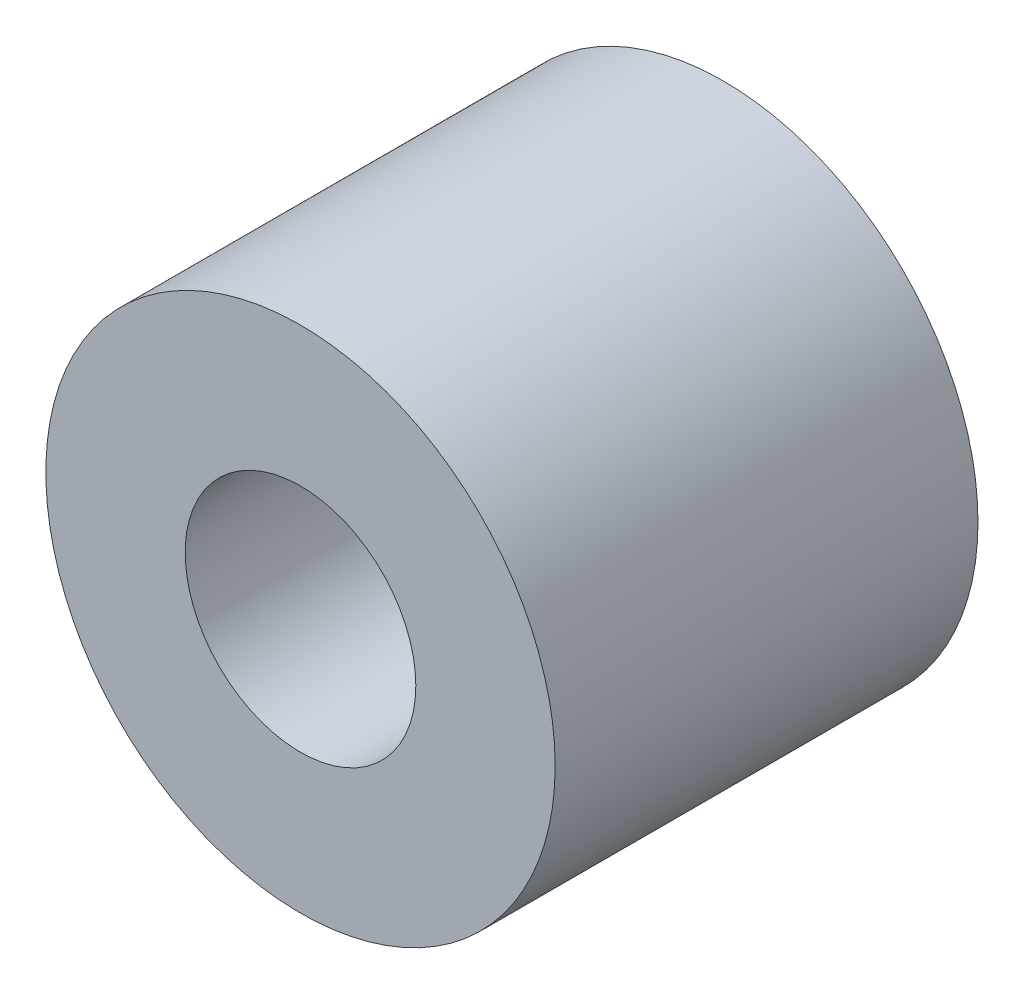
ISO-10303-21;
HEADER;
FILE_DESCRIPTION(('STEP AP214'),'2;1');
FILE_NAME('part.step','',(''),(''),'','','');
FILE_SCHEMA(('AUTOMOTIVE_DESIGN { 1 0 10303 214 1 1 1 1 }'));
ENDSEC;
DATA;
#1=APPLICATION_CONTEXT('core data for automotive mechanical design processes');
#2=APPLICATION_PROTOCOL_DEFINITION('international standard','automotive_design',2000,#1);
#3=PRODUCT_CONTEXT('',#1,'mechanical');
#4=PRODUCT('Part','Part','',(#3));
#5=PRODUCT_RELATED_PRODUCT_CATEGORY('part','',(#4));
#6=PRODUCT_DEFINITION_FORMATION('','',#4);
#7=PRODUCT_DEFINITION_CONTEXT('part definition',#1,'design');
#8=PRODUCT_DEFINITION('design','',#6,#7);
#9=PRODUCT_DEFINITION_SHAPE('','',#8);
#10=(LENGTH_UNIT() NAMED_UNIT(*) SI_UNIT(.MILLI.,.METRE.));
#11=(NAMED_UNIT(*) PLANE_ANGLE_UNIT() SI_UNIT($,.RADIAN.));
#12=(NAMED_UNIT(*) SI_UNIT($,.STERADIAN.) SOLID_ANGLE_UNIT());
#13=UNCERTAINTY_MEASURE_WITH_UNIT(LENGTH_MEASURE(1.E-05),#10,'distance_accuracy_value','');
#14=(GEOMETRIC_REPRESENTATION_CONTEXT(3) GLOBAL_UNCERTAINTY_ASSIGNED_CONTEXT((#13)) GLOBAL_UNIT_ASSIGNED_CONTEXT((#10,
#11,#12)) REPRESENTATION_CONTEXT('',''));
#15=CARTESIAN_POINT('',(0.,0.,0.));
#16=DIRECTION('',(0.,0.,1.));
#17=DIRECTION('',(1.,0.,0.));
#18=AXIS2_PLACEMENT_3D('',#15,#16,#17);
#19=CARTESIAN_POINT('',(0.,0.,44.));
#20=DIRECTION('',(0.,0.,-1.));
#21=DIRECTION('',(-1.,0.,0.));
#22=AXIS2_PLACEMENT_3D('',#19,#20,#21);
#23=CYLINDRICAL_SURFACE('',#22,26.5);
#24=CARTESIAN_POINT('',(0.,0.,44.));
#25=DIRECTION('',(0.,0.,1.));
#26=DIRECTION('',(1.,0.,0.));
#27=AXIS2_PLACEMENT_3D('',#24,#25,#26);
#28=CIRCLE('',#27,26.5);
#29=CARTESIAN_POINT('',(26.5,0.,44.));
#30=VERTEX_POINT('',#29);
#31=EDGE_CURVE('E10',#30,#30,#28,.T.);
#32=ORIENTED_EDGE('',*,*,#31,.F.);
#33=EDGE_LOOP('',(#32));
#34=FACE_BOUND('',#33,.T.);
#35=CARTESIAN_POINT('',(0.,0.,0.));
#36=DIRECTION('',(0.,0.,1.));
#37=DIRECTION('',(1.,0.,0.));
#38=AXIS2_PLACEMENT_3D('',#35,#36,#37);
#39=CIRCLE('',#38,26.5);
#40=CARTESIAN_POINT('',(26.5,0.,0.));
#41=VERTEX_POINT('',#40);
#42=EDGE_CURVE('E33',#41,#41,#39,.T.);
#43=ORIENTED_EDGE('',*,*,#42,.T.);
#44=EDGE_LOOP('',(#43));
#45=FACE_BOUND('',#44,.T.);
#46=ADVANCED_FACE('F30',(#34,#45),#23,.T.);
#47=CARTESIAN_POINT('',(0.,0.,44.));
#48=DIRECTION('',(0.,0.,1.));
#49=DIRECTION('',(1.,0.,0.));
#50=AXIS2_PLACEMENT_3D('',#47,#48,#49);
#51=PLANE('',#50);
#52=CARTESIAN_POINT('',(0.,0.,44.));
#53=DIRECTION('',(0.,0.,1.));
#54=DIRECTION('',(1.,0.,0.));
#55=AXIS2_PLACEMENT_3D('',#52,#53,#54);
#56=CIRCLE('',#55,12.);
#57=CARTESIAN_POINT('',(12.,0.,44.));
#58=VERTEX_POINT('',#57);
#59=EDGE_CURVE('E42',#58,#58,#56,.T.);
#60=ORIENTED_EDGE('',*,*,#59,.F.);
#61=EDGE_LOOP('',(#60));
#62=FACE_BOUND('',#61,.T.);
#63=ORIENTED_EDGE('',*,*,#31,.T.);
#64=EDGE_LOOP('',(#63));
#65=FACE_BOUND('',#64,.T.);
#66=ADVANCED_FACE('F57',(#62,#65),#51,.T.);
#67=CARTESIAN_POINT('',(0.,0.,0.));
#68=DIRECTION('',(0.,0.,1.));
#69=DIRECTION('',(1.,0.,0.));
#70=AXIS2_PLACEMENT_3D('',#67,#68,#69);
#71=PLANE('',#70);
#72=CARTESIAN_POINT('',(0.,0.,0.));
#73=DIRECTION('',(0.,0.,1.));
#74=DIRECTION('',(1.,0.,0.));
#75=AXIS2_PLACEMENT_3D('',#72,#73,#74);
#76=CIRCLE('',#75,12.);
#77=CARTESIAN_POINT('',(12.,0.,0.));
#78=VERTEX_POINT('',#77);
#79=EDGE_CURVE('E40',#78,#78,#76,.T.);
#80=ORIENTED_EDGE('',*,*,#79,.T.);
#81=EDGE_LOOP('',(#80));
#82=FACE_BOUND('',#81,.T.);
#83=ORIENTED_EDGE('',*,*,#42,.F.);
#84=EDGE_LOOP('',(#83));
#85=FACE_BOUND('',#84,.T.);
#86=ADVANCED_FACE('F48',(#82,#85),#71,.F.);
#87=CARTESIAN_POINT('',(0.,0.,0.));
#88=DIRECTION('',(0.,0.,1.));
#89=DIRECTION('',(1.,0.,0.));
#90=AXIS2_PLACEMENT_3D('',#87,#88,#89);
#91=CYLINDRICAL_SURFACE('',#90,12.);
#92=ORIENTED_EDGE('',*,*,#79,.F.);
#93=EDGE_LOOP('',(#92));
#94=FACE_BOUND('',#93,.T.);
#95=ORIENTED_EDGE('',*,*,#59,.T.);
#96=EDGE_LOOP('',(#95));
#97=FACE_BOUND('',#96,.T.);
#98=ADVANCED_FACE('F51',(#94,#97),#91,.F.);
#99=CLOSED_SHELL('',(#46,#66,#86,#98));
#100=MANIFOLD_SOLID_BREP('B2',#99);
#101=ADVANCED_BREP_SHAPE_REPRESENTATION('',(#18,#100),#14);
#102=SHAPE_DEFINITION_REPRESENTATION(#9,#101);
ENDSEC;
END-ISO-10303-21;
